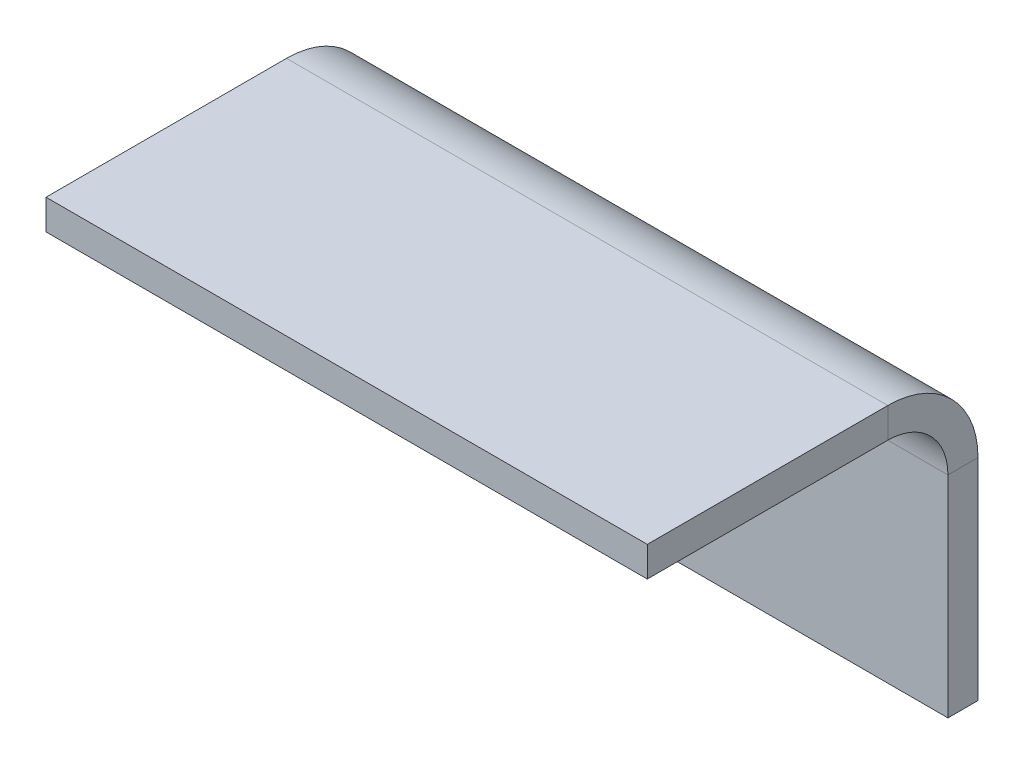
ISO-10303-21;
HEADER;
FILE_DESCRIPTION(('STEP AP214'),'2;1');
FILE_NAME('part.step','',(''),(''),'','','');
FILE_SCHEMA(('AUTOMOTIVE_DESIGN { 1 0 10303 214 1 1 1 1 }'));
ENDSEC;
DATA;
#1=APPLICATION_CONTEXT('core data for automotive mechanical design processes');
#2=APPLICATION_PROTOCOL_DEFINITION('international standard','automotive_design',2000,#1);
#3=PRODUCT_CONTEXT('',#1,'mechanical');
#4=PRODUCT('Part','Part','',(#3));
#5=PRODUCT_RELATED_PRODUCT_CATEGORY('part','',(#4));
#6=PRODUCT_DEFINITION_FORMATION('','',#4);
#7=PRODUCT_DEFINITION_CONTEXT('part definition',#1,'design');
#8=PRODUCT_DEFINITION('design','',#6,#7);
#9=PRODUCT_DEFINITION_SHAPE('','',#8);
#10=(LENGTH_UNIT() NAMED_UNIT(*) SI_UNIT(.MILLI.,.METRE.));
#11=(NAMED_UNIT(*) PLANE_ANGLE_UNIT() SI_UNIT($,.RADIAN.));
#12=(NAMED_UNIT(*) SI_UNIT($,.STERADIAN.) SOLID_ANGLE_UNIT());
#13=UNCERTAINTY_MEASURE_WITH_UNIT(LENGTH_MEASURE(1.E-05),#10,'distance_accuracy_value','');
#14=(GEOMETRIC_REPRESENTATION_CONTEXT(3) GLOBAL_UNCERTAINTY_ASSIGNED_CONTEXT((#13)) GLOBAL_UNIT_ASSIGNED_CONTEXT((#10,
#11,#12)) REPRESENTATION_CONTEXT('',''));
#15=CARTESIAN_POINT('',(0.,0.,0.));
#16=DIRECTION('',(0.,0.,1.));
#17=DIRECTION('',(1.,0.,0.));
#18=AXIS2_PLACEMENT_3D('',#15,#16,#17);
#19=CARTESIAN_POINT('',(0.,0.,-1.));
#20=DIRECTION('',(-1.,0.,0.));
#21=DIRECTION('',(0.,0.,1.));
#22=AXIS2_PLACEMENT_3D('',#19,#20,#21);
#23=PLANE('',#22);
#24=DIRECTION('',(0.,-1.,0.));
#25=VECTOR('',#24,1.);
#26=CARTESIAN_POINT('',(0.,0.,0.));
#27=LINE('',#26,#25);
#28=CARTESIAN_POINT('',(0.,7.00000000000002,0.));
#29=VERTEX_POINT('',#28);
#30=CARTESIAN_POINT('',(0.,0.,0.));
#31=VERTEX_POINT('',#30);
#32=EDGE_CURVE('E119',#29,#31,#27,.T.);
#33=ORIENTED_EDGE('',*,*,#32,.F.);
#34=DIRECTION('',(0.,0.,-1.));
#35=VECTOR('',#34,1.);
#36=CARTESIAN_POINT('',(0.,7.00000000000002,0.));
#37=LINE('',#36,#35);
#38=CARTESIAN_POINT('',(0.,7.00000000000002,-1.));
#39=VERTEX_POINT('',#38);
#40=EDGE_CURVE('E127',#29,#39,#37,.T.);
#41=ORIENTED_EDGE('',*,*,#40,.T.);
#42=DIRECTION('',(0.,-1.,0.));
#43=VECTOR('',#42,1.);
#44=CARTESIAN_POINT('',(0.,0.,-1.));
#45=LINE('',#44,#43);
#46=CARTESIAN_POINT('',(0.,0.,-1.));
#47=VERTEX_POINT('',#46);
#48=EDGE_CURVE('E114',#39,#47,#45,.T.);
#49=ORIENTED_EDGE('',*,*,#48,.T.);
#50=DIRECTION('',(0.,0.,1.));
#51=VECTOR('',#50,1.);
#52=CARTESIAN_POINT('',(0.,0.,-1.));
#53=LINE('',#52,#51);
#54=EDGE_CURVE('E69',#47,#31,#53,.T.);
#55=ORIENTED_EDGE('',*,*,#54,.T.);
#56=EDGE_LOOP('',(#33,#41,#49,#55));
#57=FACE_BOUND('',#56,.T.);
#58=ADVANCED_FACE('F61',(#57),#23,.T.);
#59=CARTESIAN_POINT('',(0.,0.,-1.));
#60=DIRECTION('',(0.,0.,-1.));
#61=DIRECTION('',(-1.,0.,0.));
#62=AXIS2_PLACEMENT_3D('',#59,#60,#61);
#63=PLANE('',#62);
#64=ORIENTED_EDGE('',*,*,#48,.F.);
#65=DIRECTION('',(-1.,0.,0.));
#66=VECTOR('',#65,1.);
#67=CARTESIAN_POINT('',(0.,7.00000000000002,-1.));
#68=LINE('',#67,#66);
#69=CARTESIAN_POINT('',(20.,7.00000000000002,-1.));
#70=VERTEX_POINT('',#69);
#71=EDGE_CURVE('E141',#39,#70,#68,.F.);
#72=ORIENTED_EDGE('',*,*,#71,.T.);
#73=DIRECTION('',(0.,1.,0.));
#74=VECTOR('',#73,1.);
#75=CARTESIAN_POINT('',(20.,0.,-1.));
#76=LINE('',#75,#74);
#77=CARTESIAN_POINT('',(20.,0.,-1.));
#78=VERTEX_POINT('',#77);
#79=EDGE_CURVE('E122',#78,#70,#76,.T.);
#80=ORIENTED_EDGE('',*,*,#79,.F.);
#81=DIRECTION('',(1.,0.,0.));
#82=VECTOR('',#81,1.);
#83=CARTESIAN_POINT('',(0.,0.,-1.));
#84=LINE('',#83,#82);
#85=EDGE_CURVE('E102',#47,#78,#84,.T.);
#86=ORIENTED_EDGE('',*,*,#85,.F.);
#87=EDGE_LOOP('',(#64,#72,#80,#86));
#88=FACE_BOUND('',#87,.T.);
#89=ADVANCED_FACE('F233',(#88),#63,.T.);
#90=CARTESIAN_POINT('',(0.,0.,0.));
#91=DIRECTION('',(0.,0.,-1.));
#92=DIRECTION('',(-1.,0.,0.));
#93=AXIS2_PLACEMENT_3D('',#90,#91,#92);
#94=PLANE('',#93);
#95=DIRECTION('',(-1.,0.,0.));
#96=VECTOR('',#95,1.);
#97=CARTESIAN_POINT('',(0.,7.00000000000002,0.));
#98=LINE('',#97,#96);
#99=CARTESIAN_POINT('',(20.,7.00000000000002,0.));
#100=VERTEX_POINT('',#99);
#101=EDGE_CURVE('E132',#29,#100,#98,.F.);
#102=ORIENTED_EDGE('',*,*,#101,.F.);
#103=ORIENTED_EDGE('',*,*,#32,.T.);
#104=DIRECTION('',(1.,0.,0.));
#105=VECTOR('',#104,1.);
#106=CARTESIAN_POINT('',(0.,0.,0.));
#107=LINE('',#106,#105);
#108=CARTESIAN_POINT('',(20.,0.,0.));
#109=VERTEX_POINT('',#108);
#110=EDGE_CURVE('E105',#31,#109,#107,.T.);
#111=ORIENTED_EDGE('',*,*,#110,.T.);
#112=DIRECTION('',(0.,1.,0.));
#113=VECTOR('',#112,1.);
#114=CARTESIAN_POINT('',(20.,0.,0.));
#115=LINE('',#114,#113);
#116=EDGE_CURVE('E110',#109,#100,#115,.T.);
#117=ORIENTED_EDGE('',*,*,#116,.T.);
#118=EDGE_LOOP('',(#102,#103,#111,#117));
#119=FACE_BOUND('',#118,.T.);
#120=ADVANCED_FACE('F113',(#119),#94,.F.);
#121=CARTESIAN_POINT('',(20.,0.,-1.));
#122=DIRECTION('',(1.,0.,0.));
#123=DIRECTION('',(0.,0.,-1.));
#124=AXIS2_PLACEMENT_3D('',#121,#122,#123);
#125=PLANE('',#124);
#126=DIRECTION('',(0.,0.,-1.));
#127=VECTOR('',#126,1.);
#128=CARTESIAN_POINT('',(20.,7.00000000000002,0.));
#129=LINE('',#128,#127);
#130=EDGE_CURVE('E109',#100,#70,#129,.T.);
#131=ORIENTED_EDGE('',*,*,#130,.F.);
#132=ORIENTED_EDGE('',*,*,#116,.F.);
#133=DIRECTION('',(0.,0.,1.));
#134=VECTOR('',#133,1.);
#135=CARTESIAN_POINT('',(20.,0.,-1.));
#136=LINE('',#135,#134);
#137=EDGE_CURVE('E13',#78,#109,#136,.T.);
#138=ORIENTED_EDGE('',*,*,#137,.F.);
#139=ORIENTED_EDGE('',*,*,#79,.T.);
#140=EDGE_LOOP('',(#131,#132,#138,#139));
#141=FACE_BOUND('',#140,.T.);
#142=ADVANCED_FACE('F107',(#141),#125,.T.);
#143=CARTESIAN_POINT('',(0.,0.,-1.));
#144=DIRECTION('',(0.,-1.,0.));
#145=DIRECTION('',(0.,0.,-1.));
#146=AXIS2_PLACEMENT_3D('',#143,#144,#145);
#147=PLANE('',#146);
#148=ORIENTED_EDGE('',*,*,#110,.F.);
#149=ORIENTED_EDGE('',*,*,#54,.F.);
#150=ORIENTED_EDGE('',*,*,#85,.T.);
#151=ORIENTED_EDGE('',*,*,#137,.T.);
#152=EDGE_LOOP('',(#148,#149,#150,#151));
#153=FACE_BOUND('',#152,.T.);
#154=ADVANCED_FACE('F97',(#153),#147,.T.);
#155=CARTESIAN_POINT('',(20.,7.00000000000002,2.));
#156=DIRECTION('',(1.,0.,0.));
#157=DIRECTION('',(0.,0.,-1.));
#158=AXIS2_PLACEMENT_3D('',#155,#156,#157);
#159=PLANE('',#158);
#160=DIRECTION('',(0.,-1.,0.));
#161=VECTOR('',#160,1.);
#162=CARTESIAN_POINT('',(20.,10.,1.99999999999998));
#163=LINE('',#162,#161);
#164=CARTESIAN_POINT('',(20.,9.00000000000001,1.99999999999999));
#165=VERTEX_POINT('',#164);
#166=CARTESIAN_POINT('',(20.,10.,1.99999999999998));
#167=VERTEX_POINT('',#166);
#168=EDGE_CURVE('E150',#165,#167,#163,.F.);
#169=ORIENTED_EDGE('',*,*,#168,.F.);
#170=CARTESIAN_POINT('',(20.,7.00000000000002,2.));
#171=DIRECTION('',(-1.,0.,0.));
#172=DIRECTION('',(0.,0.,1.));
#173=AXIS2_PLACEMENT_3D('',#170,#171,#172);
#174=CIRCLE('',#173,2.);
#175=EDGE_CURVE('E137',#100,#165,#174,.F.);
#176=ORIENTED_EDGE('',*,*,#175,.F.);
#177=ORIENTED_EDGE('',*,*,#130,.T.);
#178=CARTESIAN_POINT('',(20.,7.00000000000002,2.));
#179=DIRECTION('',(-1.,0.,0.));
#180=DIRECTION('',(0.,0.,1.));
#181=AXIS2_PLACEMENT_3D('',#178,#179,#180);
#182=CIRCLE('',#181,3.);
#183=EDGE_CURVE('E80',#70,#167,#182,.F.);
#184=ORIENTED_EDGE('',*,*,#183,.T.);
#185=EDGE_LOOP('',(#169,#176,#177,#184));
#186=FACE_BOUND('',#185,.T.);
#187=ADVANCED_FACE('F231',(#186),#159,.T.);
#188=CARTESIAN_POINT('',(0.,7.00000000000002,2.));
#189=DIRECTION('',(1.,0.,0.));
#190=DIRECTION('',(0.,0.,-1.));
#191=AXIS2_PLACEMENT_3D('',#188,#189,#190);
#192=PLANE('',#191);
#193=CARTESIAN_POINT('',(0.,7.00000000000002,2.));
#194=DIRECTION('',(-1.,0.,0.));
#195=DIRECTION('',(0.,0.,1.));
#196=AXIS2_PLACEMENT_3D('',#193,#194,#195);
#197=CIRCLE('',#196,2.);
#198=CARTESIAN_POINT('',(0.,9.00000000000001,1.99999999999999));
#199=VERTEX_POINT('',#198);
#200=EDGE_CURVE('E128',#199,#29,#197,.T.);
#201=ORIENTED_EDGE('',*,*,#200,.F.);
#202=DIRECTION('',(0.,-1.,0.));
#203=VECTOR('',#202,1.);
#204=CARTESIAN_POINT('',(0.,9.00000000000001,1.99999999999999));
#205=LINE('',#204,#203);
#206=CARTESIAN_POINT('',(0.,10.,1.99999999999998));
#207=VERTEX_POINT('',#206);
#208=EDGE_CURVE('E153',#199,#207,#205,.F.);
#209=ORIENTED_EDGE('',*,*,#208,.T.);
#210=CARTESIAN_POINT('',(0.,7.00000000000002,2.));
#211=DIRECTION('',(-1.,0.,0.));
#212=DIRECTION('',(0.,0.,1.));
#213=AXIS2_PLACEMENT_3D('',#210,#211,#212);
#214=CIRCLE('',#213,3.);
#215=EDGE_CURVE('E140',#207,#39,#214,.T.);
#216=ORIENTED_EDGE('',*,*,#215,.T.);
#217=ORIENTED_EDGE('',*,*,#40,.F.);
#218=EDGE_LOOP('',(#201,#209,#216,#217));
#219=FACE_BOUND('',#218,.T.);
#220=ADVANCED_FACE('F224',(#219),#192,.F.);
#221=CARTESIAN_POINT('',(0.,7.00000000000002,2.));
#222=DIRECTION('',(-1.,0.,0.));
#223=DIRECTION('',(0.,1.,0.));
#224=AXIS2_PLACEMENT_3D('',#221,#222,#223);
#225=CYLINDRICAL_SURFACE('',#224,3.);
#226=ORIENTED_EDGE('',*,*,#71,.F.);
#227=ORIENTED_EDGE('',*,*,#215,.F.);
#228=DIRECTION('',(-1.,0.,0.));
#229=VECTOR('',#228,1.);
#230=CARTESIAN_POINT('',(20.,10.,1.99999999999998));
#231=LINE('',#230,#229);
#232=EDGE_CURVE('E156',#207,#167,#231,.F.);
#233=ORIENTED_EDGE('',*,*,#232,.T.);
#234=ORIENTED_EDGE('',*,*,#183,.F.);
#235=EDGE_LOOP('',(#226,#227,#233,#234));
#236=FACE_BOUND('',#235,.T.);
#237=ADVANCED_FACE('F230',(#236),#225,.T.);
#238=CARTESIAN_POINT('',(0.,7.00000000000002,2.));
#239=DIRECTION('',(-1.,0.,0.));
#240=DIRECTION('',(0.,1.,0.));
#241=AXIS2_PLACEMENT_3D('',#238,#239,#240);
#242=CYLINDRICAL_SURFACE('',#241,2.);
#243=ORIENTED_EDGE('',*,*,#101,.T.);
#244=ORIENTED_EDGE('',*,*,#175,.T.);
#245=DIRECTION('',(-1.,0.,0.));
#246=VECTOR('',#245,1.);
#247=CARTESIAN_POINT('',(20.,9.00000000000001,1.99999999999999));
#248=LINE('',#247,#246);
#249=EDGE_CURVE('E147',#165,#199,#248,.T.);
#250=ORIENTED_EDGE('',*,*,#249,.T.);
#251=ORIENTED_EDGE('',*,*,#200,.T.);
#252=EDGE_LOOP('',(#243,#244,#250,#251));
#253=FACE_BOUND('',#252,.T.);
#254=ADVANCED_FACE('F217',(#253),#242,.F.);
#255=CARTESIAN_POINT('',(20.,10.,0.));
#256=DIRECTION('',(-1.,0.,0.));
#257=DIRECTION('',(0.,0.,1.));
#258=AXIS2_PLACEMENT_3D('',#255,#256,#257);
#259=PLANE('',#258);
#260=ORIENTED_EDGE('',*,*,#168,.T.);
#261=DIRECTION('',(0.,0.,-1.));
#262=VECTOR('',#261,1.);
#263=CARTESIAN_POINT('',(20.,10.,0.));
#264=LINE('',#263,#262);
#265=CARTESIAN_POINT('',(20.,10.0000000000001,9.99999999999999));
#266=VERTEX_POINT('',#265);
#267=EDGE_CURVE('E170',#266,#167,#264,.T.);
#268=ORIENTED_EDGE('',*,*,#267,.F.);
#269=DIRECTION('',(0.,-1.,0.));
#270=VECTOR('',#269,1.);
#271=CARTESIAN_POINT('',(20.,10.0000000000001,9.99999999999999));
#272=LINE('',#271,#270);
#273=CARTESIAN_POINT('',(20.,9.00000000000007,10.));
#274=VERTEX_POINT('',#273);
#275=EDGE_CURVE('E176',#266,#274,#272,.T.);
#276=ORIENTED_EDGE('',*,*,#275,.T.);
#277=DIRECTION('',(0.,0.,1.));
#278=VECTOR('',#277,1.);
#279=CARTESIAN_POINT('',(20.,9.,0.));
#280=LINE('',#279,#278);
#281=EDGE_CURVE('E158',#274,#165,#280,.F.);
#282=ORIENTED_EDGE('',*,*,#281,.T.);
#283=EDGE_LOOP('',(#260,#268,#276,#282));
#284=FACE_BOUND('',#283,.T.);
#285=ADVANCED_FACE('F228',(#284),#259,.F.);
#286=CARTESIAN_POINT('',(0.,10.,0.));
#287=DIRECTION('',(1.,0.,0.));
#288=DIRECTION('',(0.,0.,-1.));
#289=AXIS2_PLACEMENT_3D('',#286,#287,#288);
#290=PLANE('',#289);
#291=ORIENTED_EDGE('',*,*,#208,.F.);
#292=DIRECTION('',(0.,0.,-1.));
#293=VECTOR('',#292,1.);
#294=CARTESIAN_POINT('',(0.,9.,0.));
#295=LINE('',#294,#293);
#296=CARTESIAN_POINT('',(0.,9.00000000000007,10.));
#297=VERTEX_POINT('',#296);
#298=EDGE_CURVE('E161',#199,#297,#295,.F.);
#299=ORIENTED_EDGE('',*,*,#298,.T.);
#300=DIRECTION('',(0.,-1.,0.));
#301=VECTOR('',#300,1.);
#302=CARTESIAN_POINT('',(0.,10.0000000000001,9.99999999999999));
#303=LINE('',#302,#301);
#304=CARTESIAN_POINT('',(0.,10.0000000000001,9.99999999999999));
#305=VERTEX_POINT('',#304);
#306=EDGE_CURVE('E135',#305,#297,#303,.T.);
#307=ORIENTED_EDGE('',*,*,#306,.F.);
#308=DIRECTION('',(0.,0.,1.));
#309=VECTOR('',#308,1.);
#310=CARTESIAN_POINT('',(0.,10.,0.));
#311=LINE('',#310,#309);
#312=EDGE_CURVE('E168',#207,#305,#311,.T.);
#313=ORIENTED_EDGE('',*,*,#312,.F.);
#314=EDGE_LOOP('',(#291,#299,#307,#313));
#315=FACE_BOUND('',#314,.T.);
#316=ADVANCED_FACE('F193',(#315),#290,.F.);
#317=CARTESIAN_POINT('',(0.,10.,0.));
#318=DIRECTION('',(0.,-1.,0.));
#319=DIRECTION('',(0.,0.,-1.));
#320=AXIS2_PLACEMENT_3D('',#317,#318,#319);
#321=PLANE('',#320);
#322=ORIENTED_EDGE('',*,*,#232,.F.);
#323=ORIENTED_EDGE('',*,*,#312,.T.);
#324=DIRECTION('',(1.,0.,0.));
#325=VECTOR('',#324,1.);
#326=CARTESIAN_POINT('',(0.,10.0000000000001,9.99999999999999));
#327=LINE('',#326,#325);
#328=EDGE_CURVE('E172',#305,#266,#327,.T.);
#329=ORIENTED_EDGE('',*,*,#328,.T.);
#330=ORIENTED_EDGE('',*,*,#267,.T.);
#331=EDGE_LOOP('',(#322,#323,#329,#330));
#332=FACE_BOUND('',#331,.T.);
#333=ADVANCED_FACE('F227',(#332),#321,.F.);
#334=CARTESIAN_POINT('',(0.,9.,0.));
#335=DIRECTION('',(0.,-1.,0.));
#336=DIRECTION('',(0.,0.,-1.));
#337=AXIS2_PLACEMENT_3D('',#334,#335,#336);
#338=PLANE('',#337);
#339=ORIENTED_EDGE('',*,*,#298,.F.);
#340=ORIENTED_EDGE('',*,*,#249,.F.);
#341=ORIENTED_EDGE('',*,*,#281,.F.);
#342=DIRECTION('',(-1.,0.,0.));
#343=VECTOR('',#342,1.);
#344=CARTESIAN_POINT('',(20.,9.00000000000007,10.));
#345=LINE('',#344,#343);
#346=EDGE_CURVE('E163',#297,#274,#345,.F.);
#347=ORIENTED_EDGE('',*,*,#346,.F.);
#348=EDGE_LOOP('',(#339,#340,#341,#347));
#349=FACE_BOUND('',#348,.T.);
#350=ADVANCED_FACE('F221',(#349),#338,.T.);
#351=CARTESIAN_POINT('',(20.,10.0000000000001,9.99999999999999));
#352=DIRECTION('',(0.,0.,-1.));
#353=DIRECTION('',(0.,1.,0.));
#354=AXIS2_PLACEMENT_3D('',#351,#352,#353);
#355=PLANE('',#354);
#356=ORIENTED_EDGE('',*,*,#346,.T.);
#357=ORIENTED_EDGE('',*,*,#275,.F.);
#358=ORIENTED_EDGE('',*,*,#328,.F.);
#359=ORIENTED_EDGE('',*,*,#306,.T.);
#360=EDGE_LOOP('',(#356,#357,#358,#359));
#361=FACE_BOUND('',#360,.T.);
#362=ADVANCED_FACE('F184',(#361),#355,.F.);
#363=CLOSED_SHELL('',(#58,#89,#120,#142,#154,#187,#220,#237,#254,#285,#316,#333,#350,#362));
#364=MANIFOLD_SOLID_BREP('B2',#363);
#365=ADVANCED_BREP_SHAPE_REPRESENTATION('',(#18,#364),#14);
#366=SHAPE_DEFINITION_REPRESENTATION(#9,#365);
ENDSEC;
END-ISO-10303-21;
